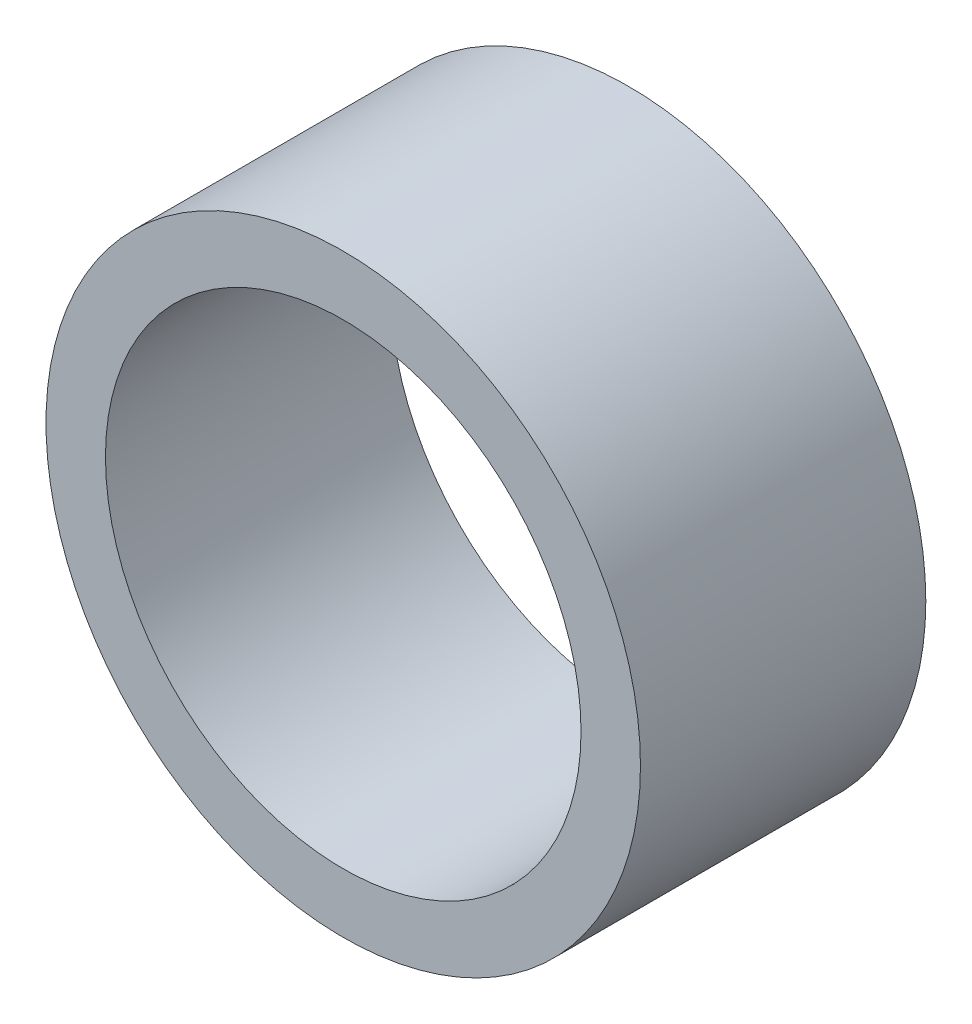
ISO-10303-21;
HEADER;
FILE_DESCRIPTION(('STEP AP214'),'2;1');
FILE_NAME('part.step','',(''),(''),'','','');
FILE_SCHEMA(('AUTOMOTIVE_DESIGN { 1 0 10303 214 1 1 1 1 }'));
ENDSEC;
DATA;
#1=APPLICATION_CONTEXT('core data for automotive mechanical design processes');
#2=APPLICATION_PROTOCOL_DEFINITION('international standard','automotive_design',2000,#1);
#3=PRODUCT_CONTEXT('',#1,'mechanical');
#4=PRODUCT('Part','Part','',(#3));
#5=PRODUCT_RELATED_PRODUCT_CATEGORY('part','',(#4));
#6=PRODUCT_DEFINITION_FORMATION('','',#4);
#7=PRODUCT_DEFINITION_CONTEXT('part definition',#1,'design');
#8=PRODUCT_DEFINITION('design','',#6,#7);
#9=PRODUCT_DEFINITION_SHAPE('','',#8);
#10=(LENGTH_UNIT() NAMED_UNIT(*) SI_UNIT(.MILLI.,.METRE.));
#11=(NAMED_UNIT(*) PLANE_ANGLE_UNIT() SI_UNIT($,.RADIAN.));
#12=(NAMED_UNIT(*) SI_UNIT($,.STERADIAN.) SOLID_ANGLE_UNIT());
#13=UNCERTAINTY_MEASURE_WITH_UNIT(LENGTH_MEASURE(1.E-05),#10,'distance_accuracy_value','');
#14=(GEOMETRIC_REPRESENTATION_CONTEXT(3) GLOBAL_UNCERTAINTY_ASSIGNED_CONTEXT((#13)) GLOBAL_UNIT_ASSIGNED_CONTEXT((#10,
#11,#12)) REPRESENTATION_CONTEXT('',''));
#15=CARTESIAN_POINT('',(0.,0.,0.));
#16=DIRECTION('',(0.,0.,1.));
#17=DIRECTION('',(1.,0.,0.));
#18=AXIS2_PLACEMENT_3D('',#15,#16,#17);
#19=CARTESIAN_POINT('',(0.,0.,12.));
#20=DIRECTION('',(0.,0.,1.));
#21=DIRECTION('',(1.,0.,0.));
#22=AXIS2_PLACEMENT_3D('',#19,#20,#21);
#23=PLANE('',#22);
#24=CARTESIAN_POINT('',(0.,0.,12.));
#25=DIRECTION('',(0.,0.,1.));
#26=DIRECTION('',(1.,0.,0.));
#27=AXIS2_PLACEMENT_3D('',#24,#25,#26);
#28=CIRCLE('',#27,12.5);
#29=CARTESIAN_POINT('',(12.5,0.,12.));
#30=VERTEX_POINT('',#29);
#31=EDGE_CURVE('E10',#30,#30,#28,.T.);
#32=ORIENTED_EDGE('',*,*,#31,.T.);
#33=EDGE_LOOP('',(#32));
#34=FACE_BOUND('',#33,.T.);
#35=CARTESIAN_POINT('',(0.,0.,12.));
#36=DIRECTION('',(0.,0.,1.));
#37=DIRECTION('',(1.,0.,0.));
#38=AXIS2_PLACEMENT_3D('',#35,#36,#37);
#39=CIRCLE('',#38,10.);
#40=CARTESIAN_POINT('',(10.,0.,12.));
#41=VERTEX_POINT('',#40);
#42=EDGE_CURVE('E44',#41,#41,#39,.T.);
#43=ORIENTED_EDGE('',*,*,#42,.F.);
#44=EDGE_LOOP('',(#43));
#45=FACE_BOUND('',#44,.T.);
#46=ADVANCED_FACE('F33',(#34,#45),#23,.T.);
#47=CARTESIAN_POINT('',(0.,0.,0.));
#48=DIRECTION('',(0.,0.,1.));
#49=DIRECTION('',(1.,0.,0.));
#50=AXIS2_PLACEMENT_3D('',#47,#48,#49);
#51=PLANE('',#50);
#52=CARTESIAN_POINT('',(0.,0.,0.));
#53=DIRECTION('',(0.,0.,1.));
#54=DIRECTION('',(1.,0.,0.));
#55=AXIS2_PLACEMENT_3D('',#52,#53,#54);
#56=CIRCLE('',#55,12.5);
#57=CARTESIAN_POINT('',(12.5,0.,0.));
#58=VERTEX_POINT('',#57);
#59=EDGE_CURVE('E37',#58,#58,#56,.T.);
#60=ORIENTED_EDGE('',*,*,#59,.F.);
#61=EDGE_LOOP('',(#60));
#62=FACE_BOUND('',#61,.T.);
#63=CARTESIAN_POINT('',(0.,0.,0.));
#64=DIRECTION('',(0.,0.,1.));
#65=DIRECTION('',(1.,0.,0.));
#66=AXIS2_PLACEMENT_3D('',#63,#64,#65);
#67=CIRCLE('',#66,10.);
#68=CARTESIAN_POINT('',(10.,0.,0.));
#69=VERTEX_POINT('',#68);
#70=EDGE_CURVE('E46',#69,#69,#67,.T.);
#71=ORIENTED_EDGE('',*,*,#70,.T.);
#72=EDGE_LOOP('',(#71));
#73=FACE_BOUND('',#72,.T.);
#74=ADVANCED_FACE('F56',(#62,#73),#51,.F.);
#75=CARTESIAN_POINT('',(0.,0.,12.));
#76=DIRECTION('',(0.,0.,-1.));
#77=DIRECTION('',(-1.,0.,0.));
#78=AXIS2_PLACEMENT_3D('',#75,#76,#77);
#79=CYLINDRICAL_SURFACE('',#78,12.5);
#80=ORIENTED_EDGE('',*,*,#31,.F.);
#81=EDGE_LOOP('',(#80));
#82=FACE_BOUND('',#81,.T.);
#83=ORIENTED_EDGE('',*,*,#59,.T.);
#84=EDGE_LOOP('',(#83));
#85=FACE_BOUND('',#84,.T.);
#86=ADVANCED_FACE('F35',(#82,#85),#79,.T.);
#87=CARTESIAN_POINT('',(0.,0.,12.));
#88=DIRECTION('',(0.,0.,-1.));
#89=DIRECTION('',(-1.,0.,0.));
#90=AXIS2_PLACEMENT_3D('',#87,#88,#89);
#91=CYLINDRICAL_SURFACE('',#90,10.);
#92=ORIENTED_EDGE('',*,*,#42,.T.);
#93=EDGE_LOOP('',(#92));
#94=FACE_BOUND('',#93,.T.);
#95=ORIENTED_EDGE('',*,*,#70,.F.);
#96=EDGE_LOOP('',(#95));
#97=FACE_BOUND('',#96,.T.);
#98=ADVANCED_FACE('F52',(#94,#97),#91,.F.);
#99=CLOSED_SHELL('',(#46,#74,#86,#98));
#100=MANIFOLD_SOLID_BREP('B2',#99);
#101=ADVANCED_BREP_SHAPE_REPRESENTATION('',(#18,#100),#14);
#102=SHAPE_DEFINITION_REPRESENTATION(#9,#101);
ENDSEC;
END-ISO-10303-21;
